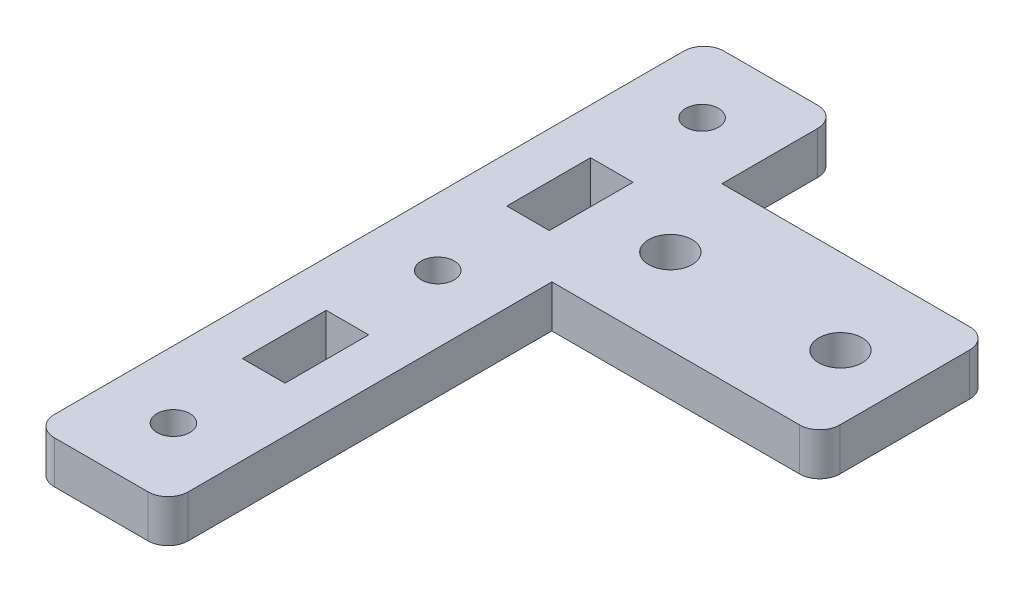
ISO-10303-21;
HEADER;
FILE_DESCRIPTION(('STEP AP214'),'2;1');
FILE_NAME('part.step','',(''),(''),'','','');
FILE_SCHEMA(('AUTOMOTIVE_DESIGN { 1 0 10303 214 1 1 1 1 }'));
ENDSEC;
DATA;
#1=APPLICATION_CONTEXT('core data for automotive mechanical design processes');
#2=APPLICATION_PROTOCOL_DEFINITION('international standard','automotive_design',2000,#1);
#3=PRODUCT_CONTEXT('',#1,'mechanical');
#4=PRODUCT('Part','Part','',(#3));
#5=PRODUCT_RELATED_PRODUCT_CATEGORY('part','',(#4));
#6=PRODUCT_DEFINITION_FORMATION('','',#4);
#7=PRODUCT_DEFINITION_CONTEXT('part definition',#1,'design');
#8=PRODUCT_DEFINITION('design','',#6,#7);
#9=PRODUCT_DEFINITION_SHAPE('','',#8);
#10=(LENGTH_UNIT() NAMED_UNIT(*) SI_UNIT(.MILLI.,.METRE.));
#11=(NAMED_UNIT(*) PLANE_ANGLE_UNIT() SI_UNIT($,.RADIAN.));
#12=(NAMED_UNIT(*) SI_UNIT($,.STERADIAN.) SOLID_ANGLE_UNIT());
#13=UNCERTAINTY_MEASURE_WITH_UNIT(LENGTH_MEASURE(1.E-05),#10,'distance_accuracy_value','');
#14=(GEOMETRIC_REPRESENTATION_CONTEXT(3) GLOBAL_UNCERTAINTY_ASSIGNED_CONTEXT((#13)) GLOBAL_UNIT_ASSIGNED_CONTEXT((#10,
#11,#12)) REPRESENTATION_CONTEXT('',''));
#15=CARTESIAN_POINT('',(0.,0.,0.));
#16=DIRECTION('',(0.,0.,1.));
#17=DIRECTION('',(1.,0.,0.));
#18=AXIS2_PLACEMENT_3D('',#15,#16,#17);
#19=CARTESIAN_POINT('',(0.,6.35,0.));
#20=DIRECTION('',(0.,-1.,0.));
#21=DIRECTION('',(0.,0.,-1.));
#22=AXIS2_PLACEMENT_3D('',#19,#20,#21);
#23=PLANE('',#22);
#24=CARTESIAN_POINT('',(50.4,6.35,-70.));
#25=DIRECTION('',(0.,1.,0.));
#26=DIRECTION('',(0.,0.,1.));
#27=AXIS2_PLACEMENT_3D('',#24,#25,#26);
#28=CIRCLE('',#27,3.24358);
#29=CARTESIAN_POINT('',(50.4,6.35,-66.75642));
#30=VERTEX_POINT('',#29);
#31=EDGE_CURVE('E479',#30,#30,#28,.T.);
#32=ORIENTED_EDGE('',*,*,#31,.F.);
#33=EDGE_LOOP('',(#32));
#34=FACE_BOUND('',#33,.T.);
#35=CARTESIAN_POINT('',(25.,6.35,-70.));
#36=DIRECTION('',(0.,1.,0.));
#37=DIRECTION('',(0.,0.,1.));
#38=AXIS2_PLACEMENT_3D('',#35,#36,#37);
#39=CIRCLE('',#38,3.24358);
#40=CARTESIAN_POINT('',(25.,6.35,-66.75642));
#41=VERTEX_POINT('',#40);
#42=EDGE_CURVE('E475',#41,#41,#39,.T.);
#43=ORIENTED_EDGE('',*,*,#42,.F.);
#44=EDGE_LOOP('',(#43));
#45=FACE_BOUND('',#44,.T.);
#46=CARTESIAN_POINT('',(10.,6.35,-89.7371));
#47=DIRECTION('',(0.,1.,0.));
#48=DIRECTION('',(0.,0.,1.));
#49=AXIS2_PLACEMENT_3D('',#46,#47,#48);
#50=CIRCLE('',#49,2.45744999999999);
#51=CARTESIAN_POINT('',(10.,6.35,-87.27965));
#52=VERTEX_POINT('',#51);
#53=EDGE_CURVE('E472',#52,#52,#50,.T.);
#54=ORIENTED_EDGE('',*,*,#53,.F.);
#55=EDGE_LOOP('',(#54));
#56=FACE_BOUND('',#55,.T.);
#57=CARTESIAN_POINT('',(10.,6.35,-10.7887));
#58=DIRECTION('',(0.,1.,0.));
#59=DIRECTION('',(0.,0.,1.));
#60=AXIS2_PLACEMENT_3D('',#57,#58,#59);
#61=CIRCLE('',#60,2.45744999999999);
#62=CARTESIAN_POINT('',(10.,6.35,-8.33125000000002));
#63=VERTEX_POINT('',#62);
#64=EDGE_CURVE('E462',#63,#63,#61,.T.);
#65=ORIENTED_EDGE('',*,*,#64,.F.);
#66=EDGE_LOOP('',(#65));
#67=FACE_BOUND('',#66,.T.);
#68=DIRECTION('',(1.,0.,0.));
#69=VECTOR('',#68,1.);
#70=CARTESIAN_POINT('',(6.82500000000001,6.35,-24.2758));
#71=LINE('',#70,#69);
#72=CARTESIAN_POINT('',(6.82500000000001,6.35,-24.2758));
#73=VERTEX_POINT('',#72);
#74=CARTESIAN_POINT('',(13.175,6.35,-24.2758));
#75=VERTEX_POINT('',#74);
#76=EDGE_CURVE('E220',#73,#75,#71,.T.);
#77=ORIENTED_EDGE('',*,*,#76,.F.);
#78=DIRECTION('',(0.,0.,1.));
#79=VECTOR('',#78,1.);
#80=CARTESIAN_POINT('',(6.825,6.35,-36.7758));
#81=LINE('',#80,#79);
#82=CARTESIAN_POINT('',(6.825,6.35,-36.7758));
#83=VERTEX_POINT('',#82);
#84=EDGE_CURVE('E190',#83,#73,#81,.T.);
#85=ORIENTED_EDGE('',*,*,#84,.F.);
#86=DIRECTION('',(-1.,0.,0.));
#87=VECTOR('',#86,1.);
#88=CARTESIAN_POINT('',(6.825,6.35,-36.7758));
#89=LINE('',#88,#87);
#90=CARTESIAN_POINT('',(13.175,6.35,-36.7758));
#91=VERTEX_POINT('',#90);
#92=EDGE_CURVE('E208',#91,#83,#89,.T.);
#93=ORIENTED_EDGE('',*,*,#92,.F.);
#94=DIRECTION('',(0.,0.,-1.));
#95=VECTOR('',#94,1.);
#96=CARTESIAN_POINT('',(13.175,6.35,-36.7758));
#97=LINE('',#96,#95);
#98=EDGE_CURVE('E211',#75,#91,#97,.T.);
#99=ORIENTED_EDGE('',*,*,#98,.F.);
#100=EDGE_LOOP('',(#77,#85,#93,#99));
#101=FACE_BOUND('',#100,.T.);
#102=DIRECTION('',(1.,0.,0.));
#103=VECTOR('',#102,1.);
#104=CARTESIAN_POINT('',(6.825,6.35,-63.75));
#105=LINE('',#104,#103);
#106=CARTESIAN_POINT('',(6.825,6.35,-63.75));
#107=VERTEX_POINT('',#106);
#108=CARTESIAN_POINT('',(13.175,6.35,-63.75));
#109=VERTEX_POINT('',#108);
#110=EDGE_CURVE('E245',#107,#109,#105,.T.);
#111=ORIENTED_EDGE('',*,*,#110,.F.);
#112=DIRECTION('',(0.,0.,1.));
#113=VECTOR('',#112,1.);
#114=CARTESIAN_POINT('',(6.825,6.35,-76.25));
#115=LINE('',#114,#113);
#116=CARTESIAN_POINT('',(6.825,6.35,-76.25));
#117=VERTEX_POINT('',#116);
#118=EDGE_CURVE('E226',#117,#107,#115,.T.);
#119=ORIENTED_EDGE('',*,*,#118,.F.);
#120=DIRECTION('',(-1.,0.,0.));
#121=VECTOR('',#120,1.);
#122=CARTESIAN_POINT('',(6.825,6.35,-76.25));
#123=LINE('',#122,#121);
#124=CARTESIAN_POINT('',(13.175,6.35,-76.25));
#125=VERTEX_POINT('',#124);
#126=EDGE_CURVE('E234',#125,#117,#123,.T.);
#127=ORIENTED_EDGE('',*,*,#126,.F.);
#128=DIRECTION('',(0.,0.,-1.));
#129=VECTOR('',#128,1.);
#130=CARTESIAN_POINT('',(13.175,6.35,-76.25));
#131=LINE('',#130,#129);
#132=EDGE_CURVE('E248',#109,#125,#131,.T.);
#133=ORIENTED_EDGE('',*,*,#132,.F.);
#134=EDGE_LOOP('',(#111,#119,#127,#133));
#135=FACE_BOUND('',#134,.T.);
#136=DIRECTION('',(0.,0.,1.));
#137=VECTOR('',#136,1.);
#138=CARTESIAN_POINT('',(0.,6.35,0.));
#139=LINE('',#138,#137);
#140=CARTESIAN_POINT('',(0.,6.35,-97.));
#141=VERTEX_POINT('',#140);
#142=CARTESIAN_POINT('',(0.,6.35,-3.));
#143=VERTEX_POINT('',#142);
#144=EDGE_CURVE('E262',#141,#143,#139,.T.);
#145=ORIENTED_EDGE('',*,*,#144,.T.);
#146=CARTESIAN_POINT('',(3.,6.35,-3.));
#147=DIRECTION('',(0.,-1.,0.));
#148=DIRECTION('',(0.,0.,-1.));
#149=AXIS2_PLACEMENT_3D('',#146,#147,#148);
#150=CIRCLE('',#149,3.);
#151=CARTESIAN_POINT('',(3.,6.35,0.));
#152=VERTEX_POINT('',#151);
#153=EDGE_CURVE('E339',#143,#152,#150,.F.);
#154=ORIENTED_EDGE('',*,*,#153,.T.);
#155=DIRECTION('',(1.,0.,0.));
#156=VECTOR('',#155,1.);
#157=CARTESIAN_POINT('',(0.,6.35,0.));
#158=LINE('',#157,#156);
#159=CARTESIAN_POINT('',(17.,6.35,0.));
#160=VERTEX_POINT('',#159);
#161=EDGE_CURVE('E265',#152,#160,#158,.T.);
#162=ORIENTED_EDGE('',*,*,#161,.T.);
#163=CARTESIAN_POINT('',(17.,6.35,-3.));
#164=DIRECTION('',(0.,-1.,0.));
#165=DIRECTION('',(0.,0.,-1.));
#166=AXIS2_PLACEMENT_3D('',#163,#164,#165);
#167=CIRCLE('',#166,3.);
#168=CARTESIAN_POINT('',(20.,6.35,-3.));
#169=VERTEX_POINT('',#168);
#170=EDGE_CURVE('E337',#160,#169,#167,.F.);
#171=ORIENTED_EDGE('',*,*,#170,.T.);
#172=DIRECTION('',(0.,0.,-1.));
#173=VECTOR('',#172,1.);
#174=CARTESIAN_POINT('',(20.,6.35,0.));
#175=LINE('',#174,#173);
#176=CARTESIAN_POINT('',(20.,6.35,-57.3));
#177=VERTEX_POINT('',#176);
#178=EDGE_CURVE('E269',#169,#177,#175,.T.);
#179=ORIENTED_EDGE('',*,*,#178,.T.);
#180=DIRECTION('',(1.,0.,0.));
#181=VECTOR('',#180,1.);
#182=CARTESIAN_POINT('',(20.,6.35,-57.3));
#183=LINE('',#182,#181);
#184=CARTESIAN_POINT('',(57.,6.35,-57.3));
#185=VERTEX_POINT('',#184);
#186=EDGE_CURVE('E271',#177,#185,#183,.T.);
#187=ORIENTED_EDGE('',*,*,#186,.T.);
#188=CARTESIAN_POINT('',(57.,6.35,-60.3));
#189=DIRECTION('',(0.,-1.,0.));
#190=DIRECTION('',(0.,0.,-1.));
#191=AXIS2_PLACEMENT_3D('',#188,#189,#190);
#192=CIRCLE('',#191,3.);
#193=CARTESIAN_POINT('',(60.,6.35,-60.3));
#194=VERTEX_POINT('',#193);
#195=EDGE_CURVE('E335',#185,#194,#192,.F.);
#196=ORIENTED_EDGE('',*,*,#195,.T.);
#197=DIRECTION('',(0.,0.,-1.));
#198=VECTOR('',#197,1.);
#199=CARTESIAN_POINT('',(60.,6.35,-82.7));
#200=LINE('',#199,#198);
#201=CARTESIAN_POINT('',(60.,6.35,-79.7));
#202=VERTEX_POINT('',#201);
#203=EDGE_CURVE('E274',#194,#202,#200,.T.);
#204=ORIENTED_EDGE('',*,*,#203,.T.);
#205=CARTESIAN_POINT('',(57.,6.35,-79.7));
#206=DIRECTION('',(0.,-1.,0.));
#207=DIRECTION('',(0.,0.,-1.));
#208=AXIS2_PLACEMENT_3D('',#205,#206,#207);
#209=CIRCLE('',#208,3.);
#210=CARTESIAN_POINT('',(57.,6.35,-82.7));
#211=VERTEX_POINT('',#210);
#212=EDGE_CURVE('E333',#202,#211,#209,.F.);
#213=ORIENTED_EDGE('',*,*,#212,.T.);
#214=DIRECTION('',(-1.,0.,0.));
#215=VECTOR('',#214,1.);
#216=CARTESIAN_POINT('',(20.,6.35,-82.7));
#217=LINE('',#216,#215);
#218=CARTESIAN_POINT('',(20.,6.35,-82.7));
#219=VERTEX_POINT('',#218);
#220=EDGE_CURVE('E277',#211,#219,#217,.T.);
#221=ORIENTED_EDGE('',*,*,#220,.T.);
#222=DIRECTION('',(0.,0.,-1.));
#223=VECTOR('',#222,1.);
#224=CARTESIAN_POINT('',(20.,6.35,-82.7));
#225=LINE('',#224,#223);
#226=CARTESIAN_POINT('',(20.,6.35,-97.));
#227=VERTEX_POINT('',#226);
#228=EDGE_CURVE('E279',#219,#227,#225,.T.);
#229=ORIENTED_EDGE('',*,*,#228,.T.);
#230=CARTESIAN_POINT('',(17.,6.35,-97.));
#231=DIRECTION('',(0.,-1.,0.));
#232=DIRECTION('',(0.,0.,-1.));
#233=AXIS2_PLACEMENT_3D('',#230,#231,#232);
#234=CIRCLE('',#233,3.);
#235=CARTESIAN_POINT('',(17.,6.35,-100.));
#236=VERTEX_POINT('',#235);
#237=EDGE_CURVE('E55',#227,#236,#234,.F.);
#238=ORIENTED_EDGE('',*,*,#237,.T.);
#239=DIRECTION('',(-1.,0.,0.));
#240=VECTOR('',#239,1.);
#241=CARTESIAN_POINT('',(0.,6.35,-100.));
#242=LINE('',#241,#240);
#243=CARTESIAN_POINT('',(3.,6.35,-100.));
#244=VERTEX_POINT('',#243);
#245=EDGE_CURVE('E281',#236,#244,#242,.T.);
#246=ORIENTED_EDGE('',*,*,#245,.T.);
#247=CARTESIAN_POINT('',(3.,6.35,-97.));
#248=DIRECTION('',(0.,-1.,0.));
#249=DIRECTION('',(0.,0.,-1.));
#250=AXIS2_PLACEMENT_3D('',#247,#248,#249);
#251=CIRCLE('',#250,3.);
#252=EDGE_CURVE('E330',#244,#141,#251,.F.);
#253=ORIENTED_EDGE('',*,*,#252,.T.);
#254=EDGE_LOOP('',(#145,#154,#162,#171,#179,#187,#196,#204,#213,#221,#229,#238,#246,#253));
#255=FACE_BOUND('',#254,.T.);
#256=CARTESIAN_POINT('',(10.,6.35,-50.2629));
#257=DIRECTION('',(0.,1.,0.));
#258=DIRECTION('',(0.,0.,1.));
#259=AXIS2_PLACEMENT_3D('',#256,#257,#258);
#260=CIRCLE('',#259,2.45744999999999);
#261=CARTESIAN_POINT('',(10.,6.35,-47.80545));
#262=VERTEX_POINT('',#261);
#263=EDGE_CURVE('E466',#262,#262,#260,.T.);
#264=ORIENTED_EDGE('',*,*,#263,.F.);
#265=EDGE_LOOP('',(#264));
#266=FACE_BOUND('',#265,.T.);
#267=ADVANCED_FACE('F33',(#34,#45,#56,#67,#101,#135,#255,#266),#23,.F.);
#268=CARTESIAN_POINT('',(0.,6.35,0.));
#269=DIRECTION('',(1.,0.,0.));
#270=DIRECTION('',(0.,0.,-1.));
#271=AXIS2_PLACEMENT_3D('',#268,#269,#270);
#272=PLANE('',#271);
#273=DIRECTION('',(0.,0.,1.));
#274=VECTOR('',#273,1.);
#275=CARTESIAN_POINT('',(0.,0.,0.));
#276=LINE('',#275,#274);
#277=CARTESIAN_POINT('',(0.,0.,-97.));
#278=VERTEX_POINT('',#277);
#279=CARTESIAN_POINT('',(0.,0.,-3.));
#280=VERTEX_POINT('',#279);
#281=EDGE_CURVE('E255',#278,#280,#276,.T.);
#282=ORIENTED_EDGE('',*,*,#281,.T.);
#283=DIRECTION('',(0.,-1.,0.));
#284=VECTOR('',#283,1.);
#285=CARTESIAN_POINT('',(0.,6.35,-3.));
#286=LINE('',#285,#284);
#287=EDGE_CURVE('E328',#280,#143,#286,.F.);
#288=ORIENTED_EDGE('',*,*,#287,.T.);
#289=ORIENTED_EDGE('',*,*,#144,.F.);
#290=DIRECTION('',(0.,-1.,0.));
#291=VECTOR('',#290,1.);
#292=CARTESIAN_POINT('',(0.,6.35,-97.));
#293=LINE('',#292,#291);
#294=EDGE_CURVE('E325',#141,#278,#293,.T.);
#295=ORIENTED_EDGE('',*,*,#294,.T.);
#296=EDGE_LOOP('',(#282,#288,#289,#295));
#297=FACE_BOUND('',#296,.T.);
#298=ADVANCED_FACE('F368',(#297),#272,.F.);
#299=CARTESIAN_POINT('',(0.,6.35,0.));
#300=DIRECTION('',(0.,0.,-1.));
#301=DIRECTION('',(-1.,0.,0.));
#302=AXIS2_PLACEMENT_3D('',#299,#300,#301);
#303=PLANE('',#302);
#304=ORIENTED_EDGE('',*,*,#161,.F.);
#305=DIRECTION('',(0.,-1.,0.));
#306=VECTOR('',#305,1.);
#307=CARTESIAN_POINT('',(3.,6.35,0.));
#308=LINE('',#307,#306);
#309=CARTESIAN_POINT('',(3.,0.,0.));
#310=VERTEX_POINT('',#309);
#311=EDGE_CURVE('E310',#152,#310,#308,.T.);
#312=ORIENTED_EDGE('',*,*,#311,.T.);
#313=DIRECTION('',(1.,0.,0.));
#314=VECTOR('',#313,1.);
#315=CARTESIAN_POINT('',(0.,0.,0.));
#316=LINE('',#315,#314);
#317=CARTESIAN_POINT('',(17.,0.,0.));
#318=VERTEX_POINT('',#317);
#319=EDGE_CURVE('E286',#310,#318,#316,.T.);
#320=ORIENTED_EDGE('',*,*,#319,.T.);
#321=DIRECTION('',(0.,-1.,0.));
#322=VECTOR('',#321,1.);
#323=CARTESIAN_POINT('',(17.,6.35,0.));
#324=LINE('',#323,#322);
#325=EDGE_CURVE('E308',#318,#160,#324,.F.);
#326=ORIENTED_EDGE('',*,*,#325,.T.);
#327=EDGE_LOOP('',(#304,#312,#320,#326));
#328=FACE_BOUND('',#327,.T.);
#329=ADVANCED_FACE('F377',(#328),#303,.F.);
#330=CARTESIAN_POINT('',(20.,6.35,0.));
#331=DIRECTION('',(-1.,0.,0.));
#332=DIRECTION('',(0.,0.,1.));
#333=AXIS2_PLACEMENT_3D('',#330,#331,#332);
#334=PLANE('',#333);
#335=ORIENTED_EDGE('',*,*,#178,.F.);
#336=DIRECTION('',(0.,-1.,0.));
#337=VECTOR('',#336,1.);
#338=CARTESIAN_POINT('',(20.,6.35,-3.));
#339=LINE('',#338,#337);
#340=CARTESIAN_POINT('',(20.,0.,-3.));
#341=VERTEX_POINT('',#340);
#342=EDGE_CURVE('E341',#169,#341,#339,.T.);
#343=ORIENTED_EDGE('',*,*,#342,.T.);
#344=DIRECTION('',(0.,0.,-1.));
#345=VECTOR('',#344,1.);
#346=CARTESIAN_POINT('',(20.,0.,0.));
#347=LINE('',#346,#345);
#348=CARTESIAN_POINT('',(20.,0.,-57.3));
#349=VERTEX_POINT('',#348);
#350=EDGE_CURVE('E289',#341,#349,#347,.T.);
#351=ORIENTED_EDGE('',*,*,#350,.T.);
#352=DIRECTION('',(0.,-1.,0.));
#353=VECTOR('',#352,1.);
#354=CARTESIAN_POINT('',(20.,6.35,-57.3));
#355=LINE('',#354,#353);
#356=EDGE_CURVE('E305',#177,#349,#355,.T.);
#357=ORIENTED_EDGE('',*,*,#356,.F.);
#358=EDGE_LOOP('',(#335,#343,#351,#357));
#359=FACE_BOUND('',#358,.T.);
#360=ADVANCED_FACE('F387',(#359),#334,.F.);
#361=CARTESIAN_POINT('',(20.,6.35,-57.3));
#362=DIRECTION('',(0.,0.,-1.));
#363=DIRECTION('',(-1.,0.,0.));
#364=AXIS2_PLACEMENT_3D('',#361,#362,#363);
#365=PLANE('',#364);
#366=DIRECTION('',(1.,0.,0.));
#367=VECTOR('',#366,1.);
#368=CARTESIAN_POINT('',(20.,0.,-57.3));
#369=LINE('',#368,#367);
#370=CARTESIAN_POINT('',(57.,0.,-57.3));
#371=VERTEX_POINT('',#370);
#372=EDGE_CURVE('E291',#349,#371,#369,.T.);
#373=ORIENTED_EDGE('',*,*,#372,.T.);
#374=DIRECTION('',(0.,-1.,0.));
#375=VECTOR('',#374,1.);
#376=CARTESIAN_POINT('',(57.,6.35,-57.3));
#377=LINE('',#376,#375);
#378=EDGE_CURVE('E349',#371,#185,#377,.F.);
#379=ORIENTED_EDGE('',*,*,#378,.T.);
#380=ORIENTED_EDGE('',*,*,#186,.F.);
#381=ORIENTED_EDGE('',*,*,#356,.T.);
#382=EDGE_LOOP('',(#373,#379,#380,#381));
#383=FACE_BOUND('',#382,.T.);
#384=ADVANCED_FACE('F605',(#383),#365,.F.);
#385=CARTESIAN_POINT('',(60.,6.35,-82.7));
#386=DIRECTION('',(-1.,0.,0.));
#387=DIRECTION('',(0.,0.,1.));
#388=AXIS2_PLACEMENT_3D('',#385,#386,#387);
#389=PLANE('',#388);
#390=ORIENTED_EDGE('',*,*,#203,.F.);
#391=DIRECTION('',(0.,-1.,0.));
#392=VECTOR('',#391,1.);
#393=CARTESIAN_POINT('',(60.,6.35,-60.3));
#394=LINE('',#393,#392);
#395=CARTESIAN_POINT('',(60.,0.,-60.3));
#396=VERTEX_POINT('',#395);
#397=EDGE_CURVE('E346',#194,#396,#394,.T.);
#398=ORIENTED_EDGE('',*,*,#397,.T.);
#399=DIRECTION('',(0.,0.,-1.));
#400=VECTOR('',#399,1.);
#401=CARTESIAN_POINT('',(60.,0.,-82.7));
#402=LINE('',#401,#400);
#403=CARTESIAN_POINT('',(60.,0.,-79.7));
#404=VERTEX_POINT('',#403);
#405=EDGE_CURVE('E294',#396,#404,#402,.T.);
#406=ORIENTED_EDGE('',*,*,#405,.T.);
#407=DIRECTION('',(0.,-1.,0.));
#408=VECTOR('',#407,1.);
#409=CARTESIAN_POINT('',(60.,6.35,-79.7));
#410=LINE('',#409,#408);
#411=EDGE_CURVE('E344',#404,#202,#410,.F.);
#412=ORIENTED_EDGE('',*,*,#411,.T.);
#413=EDGE_LOOP('',(#390,#398,#406,#412));
#414=FACE_BOUND('',#413,.T.);
#415=ADVANCED_FACE('F399',(#414),#389,.F.);
#416=CARTESIAN_POINT('',(20.,6.35,-82.7));
#417=DIRECTION('',(0.,0.,1.));
#418=DIRECTION('',(1.,0.,0.));
#419=AXIS2_PLACEMENT_3D('',#416,#417,#418);
#420=PLANE('',#419);
#421=ORIENTED_EDGE('',*,*,#220,.F.);
#422=DIRECTION('',(0.,-1.,0.));
#423=VECTOR('',#422,1.);
#424=CARTESIAN_POINT('',(57.,6.35,-82.7));
#425=LINE('',#424,#423);
#426=CARTESIAN_POINT('',(57.,0.,-82.7));
#427=VERTEX_POINT('',#426);
#428=EDGE_CURVE('E351',#211,#427,#425,.T.);
#429=ORIENTED_EDGE('',*,*,#428,.T.);
#430=DIRECTION('',(-1.,0.,0.));
#431=VECTOR('',#430,1.);
#432=CARTESIAN_POINT('',(20.,0.,-82.7));
#433=LINE('',#432,#431);
#434=CARTESIAN_POINT('',(20.,0.,-82.7));
#435=VERTEX_POINT('',#434);
#436=EDGE_CURVE('E297',#427,#435,#433,.T.);
#437=ORIENTED_EDGE('',*,*,#436,.T.);
#438=DIRECTION('',(0.,-1.,0.));
#439=VECTOR('',#438,1.);
#440=CARTESIAN_POINT('',(20.,6.35,-82.7));
#441=LINE('',#440,#439);
#442=EDGE_CURVE('E283',#219,#435,#441,.T.);
#443=ORIENTED_EDGE('',*,*,#442,.F.);
#444=EDGE_LOOP('',(#421,#429,#437,#443));
#445=FACE_BOUND('',#444,.T.);
#446=ADVANCED_FACE('F408',(#445),#420,.F.);
#447=CARTESIAN_POINT('',(20.,6.35,-82.7));
#448=DIRECTION('',(-1.,0.,0.));
#449=DIRECTION('',(0.,0.,1.));
#450=AXIS2_PLACEMENT_3D('',#447,#448,#449);
#451=PLANE('',#450);
#452=DIRECTION('',(0.,0.,-1.));
#453=VECTOR('',#452,1.);
#454=CARTESIAN_POINT('',(20.,0.,-82.7));
#455=LINE('',#454,#453);
#456=CARTESIAN_POINT('',(20.,0.,-97.));
#457=VERTEX_POINT('',#456);
#458=EDGE_CURVE('E299',#435,#457,#455,.T.);
#459=ORIENTED_EDGE('',*,*,#458,.T.);
#460=DIRECTION('',(0.,-1.,0.));
#461=VECTOR('',#460,1.);
#462=CARTESIAN_POINT('',(20.,6.35,-97.));
#463=LINE('',#462,#461);
#464=EDGE_CURVE('E11',#457,#227,#463,.F.);
#465=ORIENTED_EDGE('',*,*,#464,.T.);
#466=ORIENTED_EDGE('',*,*,#228,.F.);
#467=ORIENTED_EDGE('',*,*,#442,.T.);
#468=EDGE_LOOP('',(#459,#465,#466,#467));
#469=FACE_BOUND('',#468,.T.);
#470=ADVANCED_FACE('F414',(#469),#451,.F.);
#471=CARTESIAN_POINT('',(0.,6.35,-100.));
#472=DIRECTION('',(0.,0.,1.));
#473=DIRECTION('',(1.,0.,0.));
#474=AXIS2_PLACEMENT_3D('',#471,#472,#473);
#475=PLANE('',#474);
#476=ORIENTED_EDGE('',*,*,#245,.F.);
#477=DIRECTION('',(0.,-1.,0.));
#478=VECTOR('',#477,1.);
#479=CARTESIAN_POINT('',(17.,6.35,-100.));
#480=LINE('',#479,#478);
#481=CARTESIAN_POINT('',(17.,0.,-100.));
#482=VERTEX_POINT('',#481);
#483=EDGE_CURVE('E41',#236,#482,#480,.T.);
#484=ORIENTED_EDGE('',*,*,#483,.T.);
#485=DIRECTION('',(-1.,0.,0.));
#486=VECTOR('',#485,1.);
#487=CARTESIAN_POINT('',(0.,0.,-100.));
#488=LINE('',#487,#486);
#489=CARTESIAN_POINT('',(3.,0.,-100.));
#490=VERTEX_POINT('',#489);
#491=EDGE_CURVE('E266',#482,#490,#488,.T.);
#492=ORIENTED_EDGE('',*,*,#491,.T.);
#493=DIRECTION('',(0.,-1.,0.));
#494=VECTOR('',#493,1.);
#495=CARTESIAN_POINT('',(3.,6.35,-100.));
#496=LINE('',#495,#494);
#497=EDGE_CURVE('E48',#490,#244,#496,.F.);
#498=ORIENTED_EDGE('',*,*,#497,.T.);
#499=EDGE_LOOP('',(#476,#484,#492,#498));
#500=FACE_BOUND('',#499,.T.);
#501=ADVANCED_FACE('F357',(#500),#475,.F.);
#502=CARTESIAN_POINT('',(0.,0.,0.));
#503=DIRECTION('',(0.,-1.,0.));
#504=DIRECTION('',(0.,0.,-1.));
#505=AXIS2_PLACEMENT_3D('',#502,#503,#504);
#506=PLANE('',#505);
#507=CARTESIAN_POINT('',(50.4,0.,-70.));
#508=DIRECTION('',(0.,1.,0.));
#509=DIRECTION('',(0.,0.,1.));
#510=AXIS2_PLACEMENT_3D('',#507,#508,#509);
#511=CIRCLE('',#510,3.24358);
#512=CARTESIAN_POINT('',(50.4,0.,-66.75642));
#513=VERTEX_POINT('',#512);
#514=EDGE_CURVE('E446',#513,#513,#511,.T.);
#515=ORIENTED_EDGE('',*,*,#514,.T.);
#516=EDGE_LOOP('',(#515));
#517=FACE_BOUND('',#516,.T.);
#518=CARTESIAN_POINT('',(25.,0.,-70.));
#519=DIRECTION('',(0.,1.,0.));
#520=DIRECTION('',(0.,0.,1.));
#521=AXIS2_PLACEMENT_3D('',#518,#519,#520);
#522=CIRCLE('',#521,3.24358);
#523=CARTESIAN_POINT('',(25.,0.,-66.75642));
#524=VERTEX_POINT('',#523);
#525=EDGE_CURVE('E450',#524,#524,#522,.T.);
#526=ORIENTED_EDGE('',*,*,#525,.T.);
#527=EDGE_LOOP('',(#526));
#528=FACE_BOUND('',#527,.T.);
#529=CARTESIAN_POINT('',(10.,0.,-89.7371));
#530=DIRECTION('',(0.,1.,0.));
#531=DIRECTION('',(0.,0.,1.));
#532=AXIS2_PLACEMENT_3D('',#529,#530,#531);
#533=CIRCLE('',#532,2.45744999999999);
#534=CARTESIAN_POINT('',(10.,0.,-87.27965));
#535=VERTEX_POINT('',#534);
#536=EDGE_CURVE('E454',#535,#535,#533,.T.);
#537=ORIENTED_EDGE('',*,*,#536,.T.);
#538=EDGE_LOOP('',(#537));
#539=FACE_BOUND('',#538,.T.);
#540=CARTESIAN_POINT('',(10.,0.,-50.2629));
#541=DIRECTION('',(0.,1.,0.));
#542=DIRECTION('',(0.,0.,1.));
#543=AXIS2_PLACEMENT_3D('',#540,#541,#542);
#544=CIRCLE('',#543,2.45744999999999);
#545=CARTESIAN_POINT('',(10.,0.,-47.80545));
#546=VERTEX_POINT('',#545);
#547=EDGE_CURVE('E458',#546,#546,#544,.T.);
#548=ORIENTED_EDGE('',*,*,#547,.T.);
#549=EDGE_LOOP('',(#548));
#550=FACE_BOUND('',#549,.T.);
#551=CARTESIAN_POINT('',(10.,0.,-10.7887));
#552=DIRECTION('',(0.,1.,0.));
#553=DIRECTION('',(0.,0.,1.));
#554=AXIS2_PLACEMENT_3D('',#551,#552,#553);
#555=CIRCLE('',#554,2.45744999999999);
#556=CARTESIAN_POINT('',(10.,0.,-8.33125000000002));
#557=VERTEX_POINT('',#556);
#558=EDGE_CURVE('E214',#557,#557,#555,.T.);
#559=ORIENTED_EDGE('',*,*,#558,.T.);
#560=EDGE_LOOP('',(#559));
#561=FACE_BOUND('',#560,.T.);
#562=DIRECTION('',(0.,0.,1.));
#563=VECTOR('',#562,1.);
#564=CARTESIAN_POINT('',(6.825,0.,-36.7758));
#565=LINE('',#564,#563);
#566=CARTESIAN_POINT('',(6.825,0.,-36.7758));
#567=VERTEX_POINT('',#566);
#568=CARTESIAN_POINT('',(6.82500000000001,0.,-24.2758));
#569=VERTEX_POINT('',#568);
#570=EDGE_CURVE('E187',#567,#569,#565,.T.);
#571=ORIENTED_EDGE('',*,*,#570,.T.);
#572=DIRECTION('',(1.,0.,0.));
#573=VECTOR('',#572,1.);
#574=CARTESIAN_POINT('',(6.82500000000001,0.,-24.2758));
#575=LINE('',#574,#573);
#576=CARTESIAN_POINT('',(13.175,0.,-24.2758));
#577=VERTEX_POINT('',#576);
#578=EDGE_CURVE('E199',#569,#577,#575,.T.);
#579=ORIENTED_EDGE('',*,*,#578,.T.);
#580=DIRECTION('',(0.,0.,-1.));
#581=VECTOR('',#580,1.);
#582=CARTESIAN_POINT('',(13.175,0.,-36.7758));
#583=LINE('',#582,#581);
#584=CARTESIAN_POINT('',(13.175,0.,-36.7758));
#585=VERTEX_POINT('',#584);
#586=EDGE_CURVE('E203',#577,#585,#583,.T.);
#587=ORIENTED_EDGE('',*,*,#586,.T.);
#588=DIRECTION('',(-1.,0.,0.));
#589=VECTOR('',#588,1.);
#590=CARTESIAN_POINT('',(6.825,0.,-36.7758));
#591=LINE('',#590,#589);
#592=EDGE_CURVE('E195',#585,#567,#591,.T.);
#593=ORIENTED_EDGE('',*,*,#592,.T.);
#594=EDGE_LOOP('',(#571,#579,#587,#593));
#595=FACE_BOUND('',#594,.T.);
#596=DIRECTION('',(0.,0.,1.));
#597=VECTOR('',#596,1.);
#598=CARTESIAN_POINT('',(6.825,0.,-76.25));
#599=LINE('',#598,#597);
#600=CARTESIAN_POINT('',(6.825,0.,-76.25));
#601=VERTEX_POINT('',#600);
#602=CARTESIAN_POINT('',(6.825,0.,-63.75));
#603=VERTEX_POINT('',#602);
#604=EDGE_CURVE('E230',#601,#603,#599,.T.);
#605=ORIENTED_EDGE('',*,*,#604,.T.);
#606=DIRECTION('',(1.,0.,0.));
#607=VECTOR('',#606,1.);
#608=CARTESIAN_POINT('',(6.825,0.,-63.75));
#609=LINE('',#608,#607);
#610=CARTESIAN_POINT('',(13.175,0.,-63.75));
#611=VERTEX_POINT('',#610);
#612=EDGE_CURVE('E233',#603,#611,#609,.T.);
#613=ORIENTED_EDGE('',*,*,#612,.T.);
#614=DIRECTION('',(0.,0.,-1.));
#615=VECTOR('',#614,1.);
#616=CARTESIAN_POINT('',(13.175,0.,-76.25));
#617=LINE('',#616,#615);
#618=CARTESIAN_POINT('',(13.175,0.,-76.25));
#619=VERTEX_POINT('',#618);
#620=EDGE_CURVE('E237',#611,#619,#617,.T.);
#621=ORIENTED_EDGE('',*,*,#620,.T.);
#622=DIRECTION('',(-1.,0.,0.));
#623=VECTOR('',#622,1.);
#624=CARTESIAN_POINT('',(6.825,0.,-76.25));
#625=LINE('',#624,#623);
#626=EDGE_CURVE('E240',#619,#601,#625,.T.);
#627=ORIENTED_EDGE('',*,*,#626,.T.);
#628=EDGE_LOOP('',(#605,#613,#621,#627));
#629=FACE_BOUND('',#628,.T.);
#630=ORIENTED_EDGE('',*,*,#319,.F.);
#631=CARTESIAN_POINT('',(3.,0.,-3.));
#632=DIRECTION('',(0.,-1.,0.));
#633=DIRECTION('',(0.,0.,-1.));
#634=AXIS2_PLACEMENT_3D('',#631,#632,#633);
#635=CIRCLE('',#634,3.);
#636=EDGE_CURVE('E323',#310,#280,#635,.T.);
#637=ORIENTED_EDGE('',*,*,#636,.T.);
#638=ORIENTED_EDGE('',*,*,#281,.F.);
#639=CARTESIAN_POINT('',(3.,0.,-97.));
#640=DIRECTION('',(0.,-1.,0.));
#641=DIRECTION('',(0.,0.,-1.));
#642=AXIS2_PLACEMENT_3D('',#639,#640,#641);
#643=CIRCLE('',#642,3.);
#644=EDGE_CURVE('E313',#278,#490,#643,.T.);
#645=ORIENTED_EDGE('',*,*,#644,.T.);
#646=ORIENTED_EDGE('',*,*,#491,.F.);
#647=CARTESIAN_POINT('',(17.,0.,-97.));
#648=DIRECTION('',(0.,-1.,0.));
#649=DIRECTION('',(0.,0.,-1.));
#650=AXIS2_PLACEMENT_3D('',#647,#648,#649);
#651=CIRCLE('',#650,3.);
#652=EDGE_CURVE('E315',#482,#457,#651,.T.);
#653=ORIENTED_EDGE('',*,*,#652,.T.);
#654=ORIENTED_EDGE('',*,*,#458,.F.);
#655=ORIENTED_EDGE('',*,*,#436,.F.);
#656=CARTESIAN_POINT('',(57.,0.,-79.7));
#657=DIRECTION('',(0.,-1.,0.));
#658=DIRECTION('',(0.,0.,-1.));
#659=AXIS2_PLACEMENT_3D('',#656,#657,#658);
#660=CIRCLE('',#659,3.);
#661=EDGE_CURVE('E317',#427,#404,#660,.T.);
#662=ORIENTED_EDGE('',*,*,#661,.T.);
#663=ORIENTED_EDGE('',*,*,#405,.F.);
#664=CARTESIAN_POINT('',(57.,0.,-60.3));
#665=DIRECTION('',(0.,-1.,0.));
#666=DIRECTION('',(0.,0.,-1.));
#667=AXIS2_PLACEMENT_3D('',#664,#665,#666);
#668=CIRCLE('',#667,3.);
#669=EDGE_CURVE('E319',#396,#371,#668,.T.);
#670=ORIENTED_EDGE('',*,*,#669,.T.);
#671=ORIENTED_EDGE('',*,*,#372,.F.);
#672=ORIENTED_EDGE('',*,*,#350,.F.);
#673=CARTESIAN_POINT('',(17.,0.,-3.));
#674=DIRECTION('',(0.,-1.,0.));
#675=DIRECTION('',(0.,0.,-1.));
#676=AXIS2_PLACEMENT_3D('',#673,#674,#675);
#677=CIRCLE('',#676,3.);
#678=EDGE_CURVE('E321',#341,#318,#677,.T.);
#679=ORIENTED_EDGE('',*,*,#678,.T.);
#680=EDGE_LOOP('',(#630,#637,#638,#645,#646,#653,#654,#655,#662,#663,#670,#671,#672,#679));
#681=FACE_BOUND('',#680,.T.);
#682=ADVANCED_FACE('F205',(#517,#528,#539,#550,#561,#595,#629,#681),#506,.T.);
#683=CARTESIAN_POINT('',(6.825,0.,-76.25));
#684=DIRECTION('',(-1.,0.,0.));
#685=DIRECTION('',(0.,0.,1.));
#686=AXIS2_PLACEMENT_3D('',#683,#684,#685);
#687=PLANE('',#686);
#688=ORIENTED_EDGE('',*,*,#118,.T.);
#689=DIRECTION('',(0.,1.,0.));
#690=VECTOR('',#689,1.);
#691=CARTESIAN_POINT('',(6.825,0.,-63.75));
#692=LINE('',#691,#690);
#693=EDGE_CURVE('E243',#603,#107,#692,.T.);
#694=ORIENTED_EDGE('',*,*,#693,.F.);
#695=ORIENTED_EDGE('',*,*,#604,.F.);
#696=DIRECTION('',(0.,1.,0.));
#697=VECTOR('',#696,1.);
#698=CARTESIAN_POINT('',(6.825,0.,-76.25));
#699=LINE('',#698,#697);
#700=EDGE_CURVE('E253',#601,#117,#699,.T.);
#701=ORIENTED_EDGE('',*,*,#700,.T.);
#702=EDGE_LOOP('',(#688,#694,#695,#701));
#703=FACE_BOUND('',#702,.T.);
#704=ADVANCED_FACE('F434',(#703),#687,.F.);
#705=CARTESIAN_POINT('',(6.825,0.,-76.25));
#706=DIRECTION('',(0.,0.,-1.));
#707=DIRECTION('',(-1.,0.,0.));
#708=AXIS2_PLACEMENT_3D('',#705,#706,#707);
#709=PLANE('',#708);
#710=ORIENTED_EDGE('',*,*,#126,.T.);
#711=ORIENTED_EDGE('',*,*,#700,.F.);
#712=ORIENTED_EDGE('',*,*,#626,.F.);
#713=DIRECTION('',(0.,1.,0.));
#714=VECTOR('',#713,1.);
#715=CARTESIAN_POINT('',(13.175,0.,-76.25));
#716=LINE('',#715,#714);
#717=EDGE_CURVE('E256',#619,#125,#716,.T.);
#718=ORIENTED_EDGE('',*,*,#717,.T.);
#719=EDGE_LOOP('',(#710,#711,#712,#718));
#720=FACE_BOUND('',#719,.T.);
#721=ADVANCED_FACE('F441',(#720),#709,.F.);
#722=CARTESIAN_POINT('',(13.175,0.,-76.25));
#723=DIRECTION('',(1.,0.,0.));
#724=DIRECTION('',(0.,0.,-1.));
#725=AXIS2_PLACEMENT_3D('',#722,#723,#724);
#726=PLANE('',#725);
#727=ORIENTED_EDGE('',*,*,#132,.T.);
#728=ORIENTED_EDGE('',*,*,#717,.F.);
#729=ORIENTED_EDGE('',*,*,#620,.F.);
#730=DIRECTION('',(0.,1.,0.));
#731=VECTOR('',#730,1.);
#732=CARTESIAN_POINT('',(13.175,0.,-63.75));
#733=LINE('',#732,#731);
#734=EDGE_CURVE('E258',#611,#109,#733,.T.);
#735=ORIENTED_EDGE('',*,*,#734,.T.);
#736=EDGE_LOOP('',(#727,#728,#729,#735));
#737=FACE_BOUND('',#736,.T.);
#738=ADVANCED_FACE('F522',(#737),#726,.F.);
#739=CARTESIAN_POINT('',(6.825,0.,-63.75));
#740=DIRECTION('',(0.,0.,1.));
#741=DIRECTION('',(1.,0.,0.));
#742=AXIS2_PLACEMENT_3D('',#739,#740,#741);
#743=PLANE('',#742);
#744=ORIENTED_EDGE('',*,*,#110,.T.);
#745=ORIENTED_EDGE('',*,*,#734,.F.);
#746=ORIENTED_EDGE('',*,*,#612,.F.);
#747=ORIENTED_EDGE('',*,*,#693,.T.);
#748=EDGE_LOOP('',(#744,#745,#746,#747));
#749=FACE_BOUND('',#748,.T.);
#750=ADVANCED_FACE('F519',(#749),#743,.F.);
#751=CARTESIAN_POINT('',(6.825,0.,-36.7758));
#752=DIRECTION('',(-1.,0.,0.));
#753=DIRECTION('',(0.,0.,1.));
#754=AXIS2_PLACEMENT_3D('',#751,#752,#753);
#755=PLANE('',#754);
#756=ORIENTED_EDGE('',*,*,#84,.T.);
#757=DIRECTION('',(0.,1.,0.));
#758=VECTOR('',#757,1.);
#759=CARTESIAN_POINT('',(6.82500000000001,0.,-24.2758));
#760=LINE('',#759,#758);
#761=EDGE_CURVE('E183',#569,#73,#760,.T.);
#762=ORIENTED_EDGE('',*,*,#761,.F.);
#763=ORIENTED_EDGE('',*,*,#570,.F.);
#764=DIRECTION('',(0.,1.,0.));
#765=VECTOR('',#764,1.);
#766=CARTESIAN_POINT('',(6.825,0.,-36.7758));
#767=LINE('',#766,#765);
#768=EDGE_CURVE('E224',#567,#83,#767,.T.);
#769=ORIENTED_EDGE('',*,*,#768,.T.);
#770=EDGE_LOOP('',(#756,#762,#763,#769));
#771=FACE_BOUND('',#770,.T.);
#772=ADVANCED_FACE('F185',(#771),#755,.F.);
#773=CARTESIAN_POINT('',(6.825,0.,-36.7758));
#774=DIRECTION('',(0.,0.,-1.));
#775=DIRECTION('',(-1.,0.,0.));
#776=AXIS2_PLACEMENT_3D('',#773,#774,#775);
#777=PLANE('',#776);
#778=ORIENTED_EDGE('',*,*,#92,.T.);
#779=ORIENTED_EDGE('',*,*,#768,.F.);
#780=ORIENTED_EDGE('',*,*,#592,.F.);
#781=DIRECTION('',(0.,1.,0.));
#782=VECTOR('',#781,1.);
#783=CARTESIAN_POINT('',(13.175,0.,-36.7758));
#784=LINE('',#783,#782);
#785=EDGE_CURVE('E227',#585,#91,#784,.T.);
#786=ORIENTED_EDGE('',*,*,#785,.T.);
#787=EDGE_LOOP('',(#778,#779,#780,#786));
#788=FACE_BOUND('',#787,.T.);
#789=ADVANCED_FACE('F507',(#788),#777,.F.);
#790=CARTESIAN_POINT('',(13.175,0.,-36.7758));
#791=DIRECTION('',(1.,0.,0.));
#792=DIRECTION('',(0.,0.,-1.));
#793=AXIS2_PLACEMENT_3D('',#790,#791,#792);
#794=PLANE('',#793);
#795=ORIENTED_EDGE('',*,*,#98,.T.);
#796=ORIENTED_EDGE('',*,*,#785,.F.);
#797=ORIENTED_EDGE('',*,*,#586,.F.);
#798=DIRECTION('',(0.,1.,0.));
#799=VECTOR('',#798,1.);
#800=CARTESIAN_POINT('',(13.175,0.,-24.2758));
#801=LINE('',#800,#799);
#802=EDGE_CURVE('E194',#577,#75,#801,.T.);
#803=ORIENTED_EDGE('',*,*,#802,.T.);
#804=EDGE_LOOP('',(#795,#796,#797,#803));
#805=FACE_BOUND('',#804,.T.);
#806=ADVANCED_FACE('F510',(#805),#794,.F.);
#807=CARTESIAN_POINT('',(6.82500000000001,0.,-24.2758));
#808=DIRECTION('',(0.,0.,1.));
#809=DIRECTION('',(1.,0.,0.));
#810=AXIS2_PLACEMENT_3D('',#807,#808,#809);
#811=PLANE('',#810);
#812=ORIENTED_EDGE('',*,*,#76,.T.);
#813=ORIENTED_EDGE('',*,*,#802,.F.);
#814=ORIENTED_EDGE('',*,*,#578,.F.);
#815=ORIENTED_EDGE('',*,*,#761,.T.);
#816=EDGE_LOOP('',(#812,#813,#814,#815));
#817=FACE_BOUND('',#816,.T.);
#818=ADVANCED_FACE('F200',(#817),#811,.F.);
#819=CARTESIAN_POINT('',(10.,6.35,-10.7887));
#820=DIRECTION('',(0.,1.,0.));
#821=DIRECTION('',(0.,0.,1.));
#822=AXIS2_PLACEMENT_3D('',#819,#820,#821);
#823=CYLINDRICAL_SURFACE('',#822,2.45744999999999);
#824=ORIENTED_EDGE('',*,*,#558,.F.);
#825=EDGE_LOOP('',(#824));
#826=FACE_BOUND('',#825,.T.);
#827=ORIENTED_EDGE('',*,*,#64,.T.);
#828=EDGE_LOOP('',(#827));
#829=FACE_BOUND('',#828,.T.);
#830=ADVANCED_FACE('F503',(#826,#829),#823,.F.);
#831=CARTESIAN_POINT('',(10.,6.35,-50.2629));
#832=DIRECTION('',(0.,1.,0.));
#833=DIRECTION('',(0.,0.,1.));
#834=AXIS2_PLACEMENT_3D('',#831,#832,#833);
#835=CYLINDRICAL_SURFACE('',#834,2.45744999999999);
#836=ORIENTED_EDGE('',*,*,#547,.F.);
#837=EDGE_LOOP('',(#836));
#838=FACE_BOUND('',#837,.T.);
#839=ORIENTED_EDGE('',*,*,#263,.T.);
#840=EDGE_LOOP('',(#839));
#841=FACE_BOUND('',#840,.T.);
#842=ADVANCED_FACE('F499',(#838,#841),#835,.F.);
#843=CARTESIAN_POINT('',(10.,6.35,-89.7371));
#844=DIRECTION('',(0.,1.,0.));
#845=DIRECTION('',(0.,0.,1.));
#846=AXIS2_PLACEMENT_3D('',#843,#844,#845);
#847=CYLINDRICAL_SURFACE('',#846,2.45744999999999);
#848=ORIENTED_EDGE('',*,*,#536,.F.);
#849=EDGE_LOOP('',(#848));
#850=FACE_BOUND('',#849,.T.);
#851=ORIENTED_EDGE('',*,*,#53,.T.);
#852=EDGE_LOOP('',(#851));
#853=FACE_BOUND('',#852,.T.);
#854=ADVANCED_FACE('F493',(#850,#853),#847,.F.);
#855=CARTESIAN_POINT('',(25.,0.,-70.));
#856=DIRECTION('',(0.,1.,0.));
#857=DIRECTION('',(0.,0.,1.));
#858=AXIS2_PLACEMENT_3D('',#855,#856,#857);
#859=CYLINDRICAL_SURFACE('',#858,3.24358);
#860=ORIENTED_EDGE('',*,*,#525,.F.);
#861=EDGE_LOOP('',(#860));
#862=FACE_BOUND('',#861,.T.);
#863=ORIENTED_EDGE('',*,*,#42,.T.);
#864=EDGE_LOOP('',(#863));
#865=FACE_BOUND('',#864,.T.);
#866=ADVANCED_FACE('F485',(#862,#865),#859,.F.);
#867=CARTESIAN_POINT('',(50.4,0.,-70.));
#868=DIRECTION('',(0.,1.,0.));
#869=DIRECTION('',(0.,0.,1.));
#870=AXIS2_PLACEMENT_3D('',#867,#868,#869);
#871=CYLINDRICAL_SURFACE('',#870,3.24358);
#872=ORIENTED_EDGE('',*,*,#514,.F.);
#873=EDGE_LOOP('',(#872));
#874=FACE_BOUND('',#873,.T.);
#875=ORIENTED_EDGE('',*,*,#31,.T.);
#876=EDGE_LOOP('',(#875));
#877=FACE_BOUND('',#876,.T.);
#878=ADVANCED_FACE('F483',(#874,#877),#871,.F.);
#879=CARTESIAN_POINT('',(3.,6.35,-3.));
#880=DIRECTION('',(0.,-1.,0.));
#881=DIRECTION('',(0.,0.,-1.));
#882=AXIS2_PLACEMENT_3D('',#879,#880,#881);
#883=CYLINDRICAL_SURFACE('',#882,3.);
#884=ORIENTED_EDGE('',*,*,#153,.F.);
#885=ORIENTED_EDGE('',*,*,#287,.F.);
#886=ORIENTED_EDGE('',*,*,#636,.F.);
#887=ORIENTED_EDGE('',*,*,#311,.F.);
#888=EDGE_LOOP('',(#884,#885,#886,#887));
#889=FACE_BOUND('',#888,.T.);
#890=ADVANCED_FACE('F375',(#889),#883,.T.);
#891=CARTESIAN_POINT('',(17.,6.35,-3.));
#892=DIRECTION('',(0.,-1.,0.));
#893=DIRECTION('',(0.,0.,-1.));
#894=AXIS2_PLACEMENT_3D('',#891,#892,#893);
#895=CYLINDRICAL_SURFACE('',#894,3.);
#896=ORIENTED_EDGE('',*,*,#170,.F.);
#897=ORIENTED_EDGE('',*,*,#325,.F.);
#898=ORIENTED_EDGE('',*,*,#678,.F.);
#899=ORIENTED_EDGE('',*,*,#342,.F.);
#900=EDGE_LOOP('',(#896,#897,#898,#899));
#901=FACE_BOUND('',#900,.T.);
#902=ADVANCED_FACE('F384',(#901),#895,.T.);
#903=CARTESIAN_POINT('',(57.,6.35,-60.3));
#904=DIRECTION('',(0.,-1.,0.));
#905=DIRECTION('',(0.,0.,-1.));
#906=AXIS2_PLACEMENT_3D('',#903,#904,#905);
#907=CYLINDRICAL_SURFACE('',#906,3.);
#908=ORIENTED_EDGE('',*,*,#195,.F.);
#909=ORIENTED_EDGE('',*,*,#378,.F.);
#910=ORIENTED_EDGE('',*,*,#669,.F.);
#911=ORIENTED_EDGE('',*,*,#397,.F.);
#912=EDGE_LOOP('',(#908,#909,#910,#911));
#913=FACE_BOUND('',#912,.T.);
#914=ADVANCED_FACE('F396',(#913),#907,.T.);
#915=CARTESIAN_POINT('',(57.,6.35,-79.7));
#916=DIRECTION('',(0.,-1.,0.));
#917=DIRECTION('',(0.,0.,-1.));
#918=AXIS2_PLACEMENT_3D('',#915,#916,#917);
#919=CYLINDRICAL_SURFACE('',#918,3.);
#920=ORIENTED_EDGE('',*,*,#212,.F.);
#921=ORIENTED_EDGE('',*,*,#411,.F.);
#922=ORIENTED_EDGE('',*,*,#661,.F.);
#923=ORIENTED_EDGE('',*,*,#428,.F.);
#924=EDGE_LOOP('',(#920,#921,#922,#923));
#925=FACE_BOUND('',#924,.T.);
#926=ADVANCED_FACE('F405',(#925),#919,.T.);
#927=CARTESIAN_POINT('',(17.,6.35,-97.));
#928=DIRECTION('',(0.,-1.,0.));
#929=DIRECTION('',(0.,0.,-1.));
#930=AXIS2_PLACEMENT_3D('',#927,#928,#929);
#931=CYLINDRICAL_SURFACE('',#930,3.);
#932=ORIENTED_EDGE('',*,*,#237,.F.);
#933=ORIENTED_EDGE('',*,*,#464,.F.);
#934=ORIENTED_EDGE('',*,*,#652,.F.);
#935=ORIENTED_EDGE('',*,*,#483,.F.);
#936=EDGE_LOOP('',(#932,#933,#934,#935));
#937=FACE_BOUND('',#936,.T.);
#938=ADVANCED_FACE('F413',(#937),#931,.T.);
#939=CARTESIAN_POINT('',(3.,6.35,-97.));
#940=DIRECTION('',(0.,-1.,0.));
#941=DIRECTION('',(0.,0.,-1.));
#942=AXIS2_PLACEMENT_3D('',#939,#940,#941);
#943=CYLINDRICAL_SURFACE('',#942,3.);
#944=ORIENTED_EDGE('',*,*,#252,.F.);
#945=ORIENTED_EDGE('',*,*,#497,.F.);
#946=ORIENTED_EDGE('',*,*,#644,.F.);
#947=ORIENTED_EDGE('',*,*,#294,.F.);
#948=EDGE_LOOP('',(#944,#945,#946,#947));
#949=FACE_BOUND('',#948,.T.);
#950=ADVANCED_FACE('F35',(#949),#943,.T.);
#951=CLOSED_SHELL('',(#267,#298,#329,#360,#384,#415,#446,#470,#501,#682,#704,#721,#738,#750,
#772,#789,#806,#818,#830,#842,#854,#866,#878,#890,#902,#914,#926,#938,#950));
#952=MANIFOLD_SOLID_BREP('B2',#951);
#953=ADVANCED_BREP_SHAPE_REPRESENTATION('',(#18,#952),#14);
#954=SHAPE_DEFINITION_REPRESENTATION(#9,#953);
ENDSEC;
END-ISO-10303-21;
